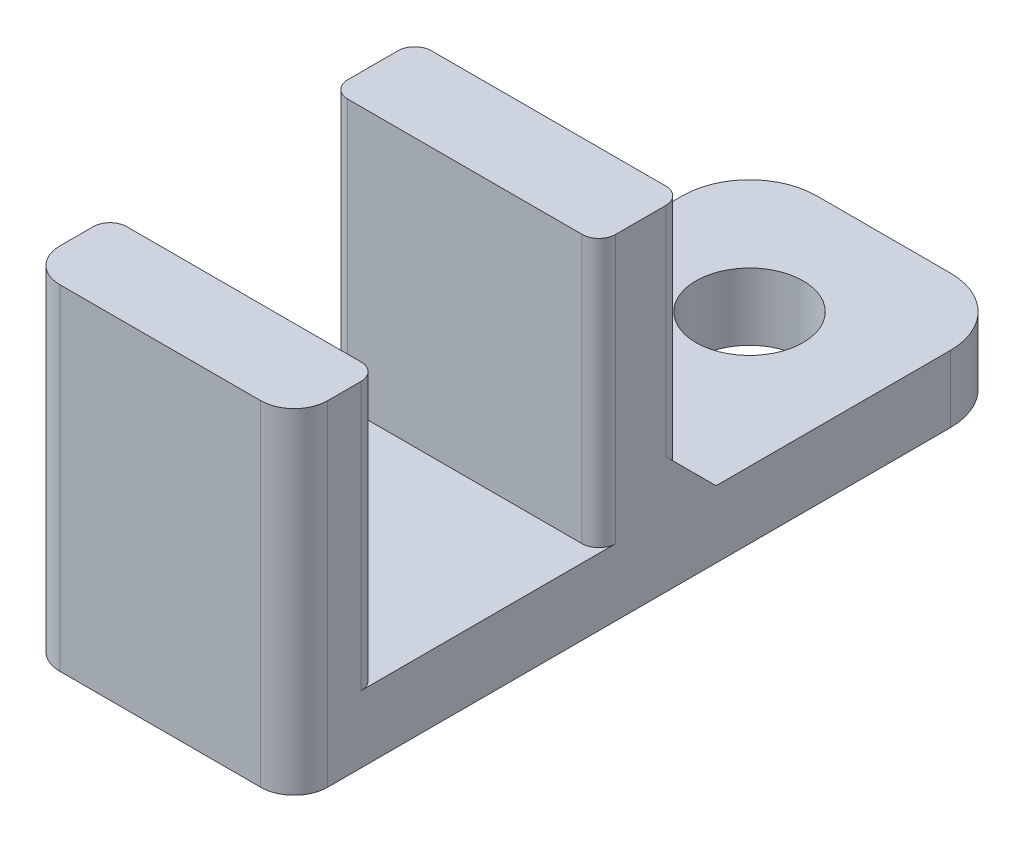
ISO-10303-21;
HEADER;
FILE_DESCRIPTION(('STEP AP214'),'2;1');
FILE_NAME('part.step','',(''),(''),'','','');
FILE_SCHEMA(('AUTOMOTIVE_DESIGN { 1 0 10303 214 1 1 1 1 }'));
ENDSEC;
DATA;
#1=APPLICATION_CONTEXT('core data for automotive mechanical design processes');
#2=APPLICATION_PROTOCOL_DEFINITION('international standard','automotive_design',2000,#1);
#3=PRODUCT_CONTEXT('',#1,'mechanical');
#4=PRODUCT('Part','Part','',(#3));
#5=PRODUCT_RELATED_PRODUCT_CATEGORY('part','',(#4));
#6=PRODUCT_DEFINITION_FORMATION('','',#4);
#7=PRODUCT_DEFINITION_CONTEXT('part definition',#1,'design');
#8=PRODUCT_DEFINITION('design','',#6,#7);
#9=PRODUCT_DEFINITION_SHAPE('','',#8);
#10=(LENGTH_UNIT() NAMED_UNIT(*) SI_UNIT(.MILLI.,.METRE.));
#11=(NAMED_UNIT(*) PLANE_ANGLE_UNIT() SI_UNIT($,.RADIAN.));
#12=(NAMED_UNIT(*) SI_UNIT($,.STERADIAN.) SOLID_ANGLE_UNIT());
#13=UNCERTAINTY_MEASURE_WITH_UNIT(LENGTH_MEASURE(1.E-05),#10,'distance_accuracy_value','');
#14=(GEOMETRIC_REPRESENTATION_CONTEXT(3) GLOBAL_UNCERTAINTY_ASSIGNED_CONTEXT((#13)) GLOBAL_UNIT_ASSIGNED_CONTEXT((#10,
#11,#12)) REPRESENTATION_CONTEXT('',''));
#15=CARTESIAN_POINT('',(0.,0.,0.));
#16=DIRECTION('',(0.,0.,1.));
#17=DIRECTION('',(1.,0.,0.));
#18=AXIS2_PLACEMENT_3D('',#15,#16,#17);
#19=CARTESIAN_POINT('',(3.5,10.,1.2));
#20=DIRECTION('',(0.,1.,0.));
#21=DIRECTION('',(0.,0.,1.));
#22=AXIS2_PLACEMENT_3D('',#19,#20,#21);
#23=CYLINDRICAL_SURFACE('',#22,0.5);
#24=DIRECTION('',(0.,1.,0.));
#25=VECTOR('',#24,1.);
#26=CARTESIAN_POINT('',(3.5,10.,1.7));
#27=LINE('',#26,#25);
#28=CARTESIAN_POINT('',(3.5,2.,1.7));
#29=VERTEX_POINT('',#28);
#30=CARTESIAN_POINT('',(3.5,10.,1.7));
#31=VERTEX_POINT('',#30);
#32=EDGE_CURVE('E306',#29,#31,#27,.T.);
#33=ORIENTED_EDGE('',*,*,#32,.F.);
#34=CARTESIAN_POINT('',(3.5,2.,1.2));
#35=DIRECTION('',(0.,-1.,0.));
#36=DIRECTION('',(0.,0.,-1.));
#37=AXIS2_PLACEMENT_3D('',#34,#35,#36);
#38=CIRCLE('',#37,0.5);
#39=CARTESIAN_POINT('',(4.,2.,1.2));
#40=VERTEX_POINT('',#39);
#41=EDGE_CURVE('E11',#29,#40,#38,.F.);
#42=ORIENTED_EDGE('',*,*,#41,.T.);
#43=DIRECTION('',(0.,1.,0.));
#44=VECTOR('',#43,1.);
#45=CARTESIAN_POINT('',(4.,2.,1.2));
#46=LINE('',#45,#44);
#47=CARTESIAN_POINT('',(4.,10.,1.2));
#48=VERTEX_POINT('',#47);
#49=EDGE_CURVE('E309',#48,#40,#46,.F.);
#50=ORIENTED_EDGE('',*,*,#49,.F.);
#51=CARTESIAN_POINT('',(3.5,10.,1.2));
#52=DIRECTION('',(0.,-1.,0.));
#53=DIRECTION('',(0.,0.,-1.));
#54=AXIS2_PLACEMENT_3D('',#51,#52,#53);
#55=CIRCLE('',#54,0.5);
#56=EDGE_CURVE('E40',#31,#48,#55,.F.);
#57=ORIENTED_EDGE('',*,*,#56,.F.);
#58=EDGE_LOOP('',(#33,#42,#50,#57));
#59=FACE_BOUND('',#58,.T.);
#60=ADVANCED_FACE('F33',(#59),#23,.T.);
#61=CARTESIAN_POINT('',(-3.5,10.,1.2));
#62=DIRECTION('',(0.,-1.,0.));
#63=DIRECTION('',(0.,0.,-1.));
#64=AXIS2_PLACEMENT_3D('',#61,#62,#63);
#65=CYLINDRICAL_SURFACE('',#64,0.5);
#66=DIRECTION('',(0.,-1.,0.));
#67=VECTOR('',#66,1.);
#68=CARTESIAN_POINT('',(-3.5,10.,1.7));
#69=LINE('',#68,#67);
#70=CARTESIAN_POINT('',(-3.5,10.,1.7));
#71=VERTEX_POINT('',#70);
#72=CARTESIAN_POINT('',(-3.5,2.,1.7));
#73=VERTEX_POINT('',#72);
#74=EDGE_CURVE('E296',#71,#73,#69,.T.);
#75=ORIENTED_EDGE('',*,*,#74,.F.);
#76=CARTESIAN_POINT('',(-3.5,10.,1.2));
#77=DIRECTION('',(0.,-1.,0.));
#78=DIRECTION('',(0.,0.,-1.));
#79=AXIS2_PLACEMENT_3D('',#76,#77,#78);
#80=CIRCLE('',#79,0.5);
#81=CARTESIAN_POINT('',(-4.,10.,1.2));
#82=VERTEX_POINT('',#81);
#83=EDGE_CURVE('E302',#82,#71,#80,.F.);
#84=ORIENTED_EDGE('',*,*,#83,.F.);
#85=DIRECTION('',(0.,-1.,0.));
#86=VECTOR('',#85,1.);
#87=CARTESIAN_POINT('',(-4.,2.,1.2));
#88=LINE('',#87,#86);
#89=CARTESIAN_POINT('',(-4.,2.,1.2));
#90=VERTEX_POINT('',#89);
#91=EDGE_CURVE('E299',#90,#82,#88,.F.);
#92=ORIENTED_EDGE('',*,*,#91,.F.);
#93=CARTESIAN_POINT('',(-3.5,2.,1.2));
#94=DIRECTION('',(0.,-1.,0.));
#95=DIRECTION('',(0.,0.,-1.));
#96=AXIS2_PLACEMENT_3D('',#93,#94,#95);
#97=CIRCLE('',#96,0.5);
#98=EDGE_CURVE('E304',#90,#73,#97,.F.);
#99=ORIENTED_EDGE('',*,*,#98,.T.);
#100=EDGE_LOOP('',(#75,#84,#92,#99));
#101=FACE_BOUND('',#100,.T.);
#102=ADVANCED_FACE('F395',(#101),#65,.T.);
#103=CARTESIAN_POINT('',(-3.5,2.,8.8));
#104=DIRECTION('',(0.,-1.,0.));
#105=DIRECTION('',(0.,0.,-1.));
#106=AXIS2_PLACEMENT_3D('',#103,#104,#105);
#107=CYLINDRICAL_SURFACE('',#106,0.5);
#108=DIRECTION('',(0.,-1.,0.));
#109=VECTOR('',#108,1.);
#110=CARTESIAN_POINT('',(-4.,2.,8.8));
#111=LINE('',#110,#109);
#112=CARTESIAN_POINT('',(-4.,10.,8.8));
#113=VERTEX_POINT('',#112);
#114=CARTESIAN_POINT('',(-4.,2.,8.8));
#115=VERTEX_POINT('',#114);
#116=EDGE_CURVE('E285',#113,#115,#111,.T.);
#117=ORIENTED_EDGE('',*,*,#116,.F.);
#118=CARTESIAN_POINT('',(-3.5,10.,8.8));
#119=DIRECTION('',(0.,-1.,0.));
#120=DIRECTION('',(0.,0.,-1.));
#121=AXIS2_PLACEMENT_3D('',#118,#119,#120);
#122=CIRCLE('',#121,0.5);
#123=CARTESIAN_POINT('',(-3.5,10.,8.3));
#124=VERTEX_POINT('',#123);
#125=EDGE_CURVE('E291',#124,#113,#122,.F.);
#126=ORIENTED_EDGE('',*,*,#125,.F.);
#127=DIRECTION('',(0.,-1.,0.));
#128=VECTOR('',#127,1.);
#129=CARTESIAN_POINT('',(-3.5,10.,8.3));
#130=LINE('',#129,#128);
#131=CARTESIAN_POINT('',(-3.5,2.,8.3));
#132=VERTEX_POINT('',#131);
#133=EDGE_CURVE('E288',#132,#124,#130,.F.);
#134=ORIENTED_EDGE('',*,*,#133,.F.);
#135=CARTESIAN_POINT('',(-3.5,2.,8.8));
#136=DIRECTION('',(0.,-1.,0.));
#137=DIRECTION('',(0.,0.,-1.));
#138=AXIS2_PLACEMENT_3D('',#135,#136,#137);
#139=CIRCLE('',#138,0.5);
#140=EDGE_CURVE('E293',#132,#115,#139,.F.);
#141=ORIENTED_EDGE('',*,*,#140,.T.);
#142=EDGE_LOOP('',(#117,#126,#134,#141));
#143=FACE_BOUND('',#142,.T.);
#144=ADVANCED_FACE('F400',(#143),#107,.T.);
#145=CARTESIAN_POINT('',(3.5,2.,8.8));
#146=DIRECTION('',(0.,1.,0.));
#147=DIRECTION('',(0.,0.,1.));
#148=AXIS2_PLACEMENT_3D('',#145,#146,#147);
#149=CYLINDRICAL_SURFACE('',#148,0.5);
#150=DIRECTION('',(0.,1.,0.));
#151=VECTOR('',#150,1.);
#152=CARTESIAN_POINT('',(4.,2.,8.8));
#153=LINE('',#152,#151);
#154=CARTESIAN_POINT('',(4.,2.,8.8));
#155=VERTEX_POINT('',#154);
#156=CARTESIAN_POINT('',(4.,10.,8.8));
#157=VERTEX_POINT('',#156);
#158=EDGE_CURVE('E275',#155,#157,#153,.T.);
#159=ORIENTED_EDGE('',*,*,#158,.F.);
#160=CARTESIAN_POINT('',(3.5,2.,8.8));
#161=DIRECTION('',(0.,-1.,0.));
#162=DIRECTION('',(0.,0.,-1.));
#163=AXIS2_PLACEMENT_3D('',#160,#161,#162);
#164=CIRCLE('',#163,0.5);
#165=CARTESIAN_POINT('',(3.5,2.,8.3));
#166=VERTEX_POINT('',#165);
#167=EDGE_CURVE('E283',#155,#166,#164,.F.);
#168=ORIENTED_EDGE('',*,*,#167,.T.);
#169=DIRECTION('',(0.,1.,0.));
#170=VECTOR('',#169,1.);
#171=CARTESIAN_POINT('',(3.5,10.,8.3));
#172=LINE('',#171,#170);
#173=CARTESIAN_POINT('',(3.5,10.,8.3));
#174=VERTEX_POINT('',#173);
#175=EDGE_CURVE('E278',#174,#166,#172,.F.);
#176=ORIENTED_EDGE('',*,*,#175,.F.);
#177=CARTESIAN_POINT('',(3.5,10.,8.8));
#178=DIRECTION('',(0.,-1.,0.));
#179=DIRECTION('',(0.,0.,-1.));
#180=AXIS2_PLACEMENT_3D('',#177,#178,#179);
#181=CIRCLE('',#180,0.5);
#182=EDGE_CURVE('E281',#157,#174,#181,.F.);
#183=ORIENTED_EDGE('',*,*,#182,.F.);
#184=EDGE_LOOP('',(#159,#168,#176,#183));
#185=FACE_BOUND('',#184,.T.);
#186=ADVANCED_FACE('F405',(#185),#149,.T.);
#187=CARTESIAN_POINT('',(-3.5,2.,-0.3));
#188=DIRECTION('',(0.,-1.,0.));
#189=DIRECTION('',(0.,0.,-1.));
#190=AXIS2_PLACEMENT_3D('',#187,#188,#189);
#191=CYLINDRICAL_SURFACE('',#190,0.5);
#192=DIRECTION('',(0.,-1.,0.));
#193=VECTOR('',#192,1.);
#194=CARTESIAN_POINT('',(-4.,2.,-0.3));
#195=LINE('',#194,#193);
#196=CARTESIAN_POINT('',(-4.,10.,-0.3));
#197=VERTEX_POINT('',#196);
#198=CARTESIAN_POINT('',(-4.,3.50000000000001,-0.3));
#199=VERTEX_POINT('',#198);
#200=EDGE_CURVE('E264',#197,#199,#195,.T.);
#201=ORIENTED_EDGE('',*,*,#200,.F.);
#202=CARTESIAN_POINT('',(-3.5,10.,-0.3));
#203=DIRECTION('',(0.,-1.,0.));
#204=DIRECTION('',(0.,0.,-1.));
#205=AXIS2_PLACEMENT_3D('',#202,#203,#204);
#206=CIRCLE('',#205,0.5);
#207=CARTESIAN_POINT('',(-3.5,10.,-0.8));
#208=VERTEX_POINT('',#207);
#209=EDGE_CURVE('E270',#208,#197,#206,.F.);
#210=ORIENTED_EDGE('',*,*,#209,.F.);
#211=DIRECTION('',(0.,-1.,0.));
#212=VECTOR('',#211,1.);
#213=CARTESIAN_POINT('',(-3.5,10.,-0.8));
#214=LINE('',#213,#212);
#215=CARTESIAN_POINT('',(-3.5,3.,-0.8));
#216=VERTEX_POINT('',#215);
#217=EDGE_CURVE('E267',#216,#208,#214,.F.);
#218=ORIENTED_EDGE('',*,*,#217,.F.);
#219=CARTESIAN_POINT('',(-3.5,3.50000000000001,-0.3));
#220=DIRECTION('',(0.,0.707106781186544,-0.707106781186551));
#221=DIRECTION('',(0.,-0.707106781186551,-0.707106781186544));
#222=AXIS2_PLACEMENT_3D('',#219,#220,#221);
#223=ELLIPSE('',#222,0.707106781186551,0.5);
#224=EDGE_CURVE('E272',#216,#199,#223,.T.);
#225=ORIENTED_EDGE('',*,*,#224,.T.);
#226=EDGE_LOOP('',(#201,#210,#218,#225));
#227=FACE_BOUND('',#226,.T.);
#228=ADVANCED_FACE('F412',(#227),#191,.T.);
#229=CARTESIAN_POINT('',(3.5,10.,-0.3));
#230=DIRECTION('',(0.,-1.,0.));
#231=DIRECTION('',(0.,0.,-1.));
#232=AXIS2_PLACEMENT_3D('',#229,#230,#231);
#233=CYLINDRICAL_SURFACE('',#232,0.5);
#234=DIRECTION('',(0.,-1.,0.));
#235=VECTOR('',#234,1.);
#236=CARTESIAN_POINT('',(3.5,10.,-0.8));
#237=LINE('',#236,#235);
#238=CARTESIAN_POINT('',(3.5,10.,-0.8));
#239=VERTEX_POINT('',#238);
#240=CARTESIAN_POINT('',(3.5,3.,-0.8));
#241=VERTEX_POINT('',#240);
#242=EDGE_CURVE('E254',#239,#241,#237,.T.);
#243=ORIENTED_EDGE('',*,*,#242,.F.);
#244=CARTESIAN_POINT('',(3.5,10.,-0.3));
#245=DIRECTION('',(0.,-1.,0.));
#246=DIRECTION('',(0.,0.,-1.));
#247=AXIS2_PLACEMENT_3D('',#244,#245,#246);
#248=CIRCLE('',#247,0.5);
#249=CARTESIAN_POINT('',(4.,10.,-0.3));
#250=VERTEX_POINT('',#249);
#251=EDGE_CURVE('E260',#250,#239,#248,.F.);
#252=ORIENTED_EDGE('',*,*,#251,.F.);
#253=DIRECTION('',(0.,-1.,0.));
#254=VECTOR('',#253,1.);
#255=CARTESIAN_POINT('',(4.,2.,-0.3));
#256=LINE('',#255,#254);
#257=CARTESIAN_POINT('',(4.,3.50000000000001,-0.3));
#258=VERTEX_POINT('',#257);
#259=EDGE_CURVE('E257',#258,#250,#256,.F.);
#260=ORIENTED_EDGE('',*,*,#259,.F.);
#261=CARTESIAN_POINT('',(3.5,3.50000000000001,-0.3));
#262=DIRECTION('',(0.,0.707106781186544,-0.707106781186551));
#263=DIRECTION('',(0.,-0.707106781186551,-0.707106781186544));
#264=AXIS2_PLACEMENT_3D('',#261,#262,#263);
#265=ELLIPSE('',#264,0.707106781186551,0.5);
#266=EDGE_CURVE('E262',#258,#241,#265,.T.);
#267=ORIENTED_EDGE('',*,*,#266,.T.);
#268=EDGE_LOOP('',(#243,#252,#260,#267));
#269=FACE_BOUND('',#268,.T.);
#270=ADVANCED_FACE('F371',(#269),#233,.T.);
#271=CARTESIAN_POINT('',(-3.,2.,9.8));
#272=DIRECTION('',(0.,1.,0.));
#273=DIRECTION('',(0.,0.,1.));
#274=AXIS2_PLACEMENT_3D('',#271,#272,#273);
#275=CYLINDRICAL_SURFACE('',#274,1.);
#276=DIRECTION('',(0.,1.,0.));
#277=VECTOR('',#276,1.);
#278=CARTESIAN_POINT('',(-4.,2.,9.8));
#279=LINE('',#278,#277);
#280=CARTESIAN_POINT('',(-4.,0.,9.8));
#281=VERTEX_POINT('',#280);
#282=CARTESIAN_POINT('',(-4.,10.,9.8));
#283=VERTEX_POINT('',#282);
#284=EDGE_CURVE('E237',#281,#283,#279,.T.);
#285=ORIENTED_EDGE('',*,*,#284,.F.);
#286=CARTESIAN_POINT('',(-3.,0.,9.8));
#287=DIRECTION('',(0.,-1.,0.));
#288=DIRECTION('',(0.,0.,-1.));
#289=AXIS2_PLACEMENT_3D('',#286,#287,#288);
#290=CIRCLE('',#289,1.);
#291=CARTESIAN_POINT('',(-3.,0.,10.8));
#292=VERTEX_POINT('',#291);
#293=EDGE_CURVE('E198',#292,#281,#290,.T.);
#294=ORIENTED_EDGE('',*,*,#293,.F.);
#295=DIRECTION('',(0.,1.,0.));
#296=VECTOR('',#295,1.);
#297=CARTESIAN_POINT('',(-3.,2.,10.8));
#298=LINE('',#297,#296);
#299=CARTESIAN_POINT('',(-3.,10.,10.8));
#300=VERTEX_POINT('',#299);
#301=EDGE_CURVE('E239',#300,#292,#298,.F.);
#302=ORIENTED_EDGE('',*,*,#301,.F.);
#303=CARTESIAN_POINT('',(-3.,10.,9.8));
#304=DIRECTION('',(0.,-1.,0.));
#305=DIRECTION('',(0.,0.,-1.));
#306=AXIS2_PLACEMENT_3D('',#303,#304,#305);
#307=CIRCLE('',#306,1.);
#308=EDGE_CURVE('E243',#283,#300,#307,.F.);
#309=ORIENTED_EDGE('',*,*,#308,.F.);
#310=EDGE_LOOP('',(#285,#294,#302,#309));
#311=FACE_BOUND('',#310,.T.);
#312=ADVANCED_FACE('F419',(#311),#275,.T.);
#313=CARTESIAN_POINT('',(3.,2.,9.8));
#314=DIRECTION('',(0.,-1.,0.));
#315=DIRECTION('',(0.,0.,-1.));
#316=AXIS2_PLACEMENT_3D('',#313,#314,#315);
#317=CYLINDRICAL_SURFACE('',#316,1.);
#318=DIRECTION('',(0.,-1.,0.));
#319=VECTOR('',#318,1.);
#320=CARTESIAN_POINT('',(4.,2.,9.8));
#321=LINE('',#320,#319);
#322=CARTESIAN_POINT('',(4.,10.,9.8));
#323=VERTEX_POINT('',#322);
#324=CARTESIAN_POINT('',(4.,0.,9.8));
#325=VERTEX_POINT('',#324);
#326=EDGE_CURVE('E226',#323,#325,#321,.T.);
#327=ORIENTED_EDGE('',*,*,#326,.F.);
#328=CARTESIAN_POINT('',(3.,10.,9.8));
#329=DIRECTION('',(0.,-1.,0.));
#330=DIRECTION('',(0.,0.,-1.));
#331=AXIS2_PLACEMENT_3D('',#328,#329,#330);
#332=CIRCLE('',#331,1.);
#333=CARTESIAN_POINT('',(3.,10.,10.8));
#334=VERTEX_POINT('',#333);
#335=EDGE_CURVE('E232',#334,#323,#332,.F.);
#336=ORIENTED_EDGE('',*,*,#335,.F.);
#337=DIRECTION('',(0.,-1.,0.));
#338=VECTOR('',#337,1.);
#339=CARTESIAN_POINT('',(3.,2.,10.8));
#340=LINE('',#339,#338);
#341=CARTESIAN_POINT('',(3.,0.,10.8));
#342=VERTEX_POINT('',#341);
#343=EDGE_CURVE('E229',#342,#334,#340,.F.);
#344=ORIENTED_EDGE('',*,*,#343,.F.);
#345=CARTESIAN_POINT('',(3.,0.,9.8));
#346=DIRECTION('',(0.,-1.,0.));
#347=DIRECTION('',(0.,0.,-1.));
#348=AXIS2_PLACEMENT_3D('',#345,#346,#347);
#349=CIRCLE('',#348,1.);
#350=EDGE_CURVE('E234',#325,#342,#349,.T.);
#351=ORIENTED_EDGE('',*,*,#350,.F.);
#352=EDGE_LOOP('',(#327,#336,#344,#351));
#353=FACE_BOUND('',#352,.T.);
#354=ADVANCED_FACE('F423',(#353),#317,.T.);
#355=CARTESIAN_POINT('',(2.,2.,-8.8));
#356=DIRECTION('',(0.,-1.,0.));
#357=DIRECTION('',(0.,0.,-1.));
#358=AXIS2_PLACEMENT_3D('',#355,#356,#357);
#359=CYLINDRICAL_SURFACE('',#358,2.);
#360=DIRECTION('',(0.,-1.,0.));
#361=VECTOR('',#360,1.);
#362=CARTESIAN_POINT('',(2.,2.,-10.8));
#363=LINE('',#362,#361);
#364=CARTESIAN_POINT('',(2.,2.,-10.8));
#365=VERTEX_POINT('',#364);
#366=CARTESIAN_POINT('',(2.,0.,-10.8));
#367=VERTEX_POINT('',#366);
#368=EDGE_CURVE('E185',#365,#367,#363,.T.);
#369=ORIENTED_EDGE('',*,*,#368,.F.);
#370=CARTESIAN_POINT('',(2.,2.,-8.8));
#371=DIRECTION('',(0.,-1.,0.));
#372=DIRECTION('',(0.,0.,-1.));
#373=AXIS2_PLACEMENT_3D('',#370,#371,#372);
#374=CIRCLE('',#373,2.);
#375=CARTESIAN_POINT('',(4.,2.,-8.8));
#376=VERTEX_POINT('',#375);
#377=EDGE_CURVE('E221',#376,#365,#374,.F.);
#378=ORIENTED_EDGE('',*,*,#377,.F.);
#379=DIRECTION('',(0.,-1.,0.));
#380=VECTOR('',#379,1.);
#381=CARTESIAN_POINT('',(4.,2.,-8.8));
#382=LINE('',#381,#380);
#383=CARTESIAN_POINT('',(4.,0.,-8.8));
#384=VERTEX_POINT('',#383);
#385=EDGE_CURVE('E218',#384,#376,#382,.F.);
#386=ORIENTED_EDGE('',*,*,#385,.F.);
#387=CARTESIAN_POINT('',(2.,0.,-8.8));
#388=DIRECTION('',(0.,-1.,0.));
#389=DIRECTION('',(0.,0.,-1.));
#390=AXIS2_PLACEMENT_3D('',#387,#388,#389);
#391=CIRCLE('',#390,2.);
#392=EDGE_CURVE('E223',#367,#384,#391,.T.);
#393=ORIENTED_EDGE('',*,*,#392,.F.);
#394=EDGE_LOOP('',(#369,#378,#386,#393));
#395=FACE_BOUND('',#394,.T.);
#396=ADVANCED_FACE('F357',(#395),#359,.T.);
#397=CARTESIAN_POINT('',(-2.,2.,-8.8));
#398=DIRECTION('',(0.,-1.,0.));
#399=DIRECTION('',(0.,0.,-1.));
#400=AXIS2_PLACEMENT_3D('',#397,#398,#399);
#401=CYLINDRICAL_SURFACE('',#400,2.);
#402=DIRECTION('',(0.,-1.,0.));
#403=VECTOR('',#402,1.);
#404=CARTESIAN_POINT('',(-4.,2.,-8.8));
#405=LINE('',#404,#403);
#406=CARTESIAN_POINT('',(-4.,2.,-8.8));
#407=VERTEX_POINT('',#406);
#408=CARTESIAN_POINT('',(-4.,0.,-8.8));
#409=VERTEX_POINT('',#408);
#410=EDGE_CURVE('E178',#407,#409,#405,.T.);
#411=ORIENTED_EDGE('',*,*,#410,.F.);
#412=CARTESIAN_POINT('',(-2.,2.,-8.8));
#413=DIRECTION('',(0.,-1.,0.));
#414=DIRECTION('',(0.,0.,-1.));
#415=AXIS2_PLACEMENT_3D('',#412,#413,#414);
#416=CIRCLE('',#415,2.);
#417=CARTESIAN_POINT('',(-2.,2.,-10.8));
#418=VERTEX_POINT('',#417);
#419=EDGE_CURVE('E186',#418,#407,#416,.F.);
#420=ORIENTED_EDGE('',*,*,#419,.F.);
#421=DIRECTION('',(0.,-1.,0.));
#422=VECTOR('',#421,1.);
#423=CARTESIAN_POINT('',(-2.,2.,-10.8));
#424=LINE('',#423,#422);
#425=CARTESIAN_POINT('',(-2.,0.,-10.8));
#426=VERTEX_POINT('',#425);
#427=EDGE_CURVE('E181',#426,#418,#424,.F.);
#428=ORIENTED_EDGE('',*,*,#427,.F.);
#429=CARTESIAN_POINT('',(-2.,0.,-8.8));
#430=DIRECTION('',(0.,-1.,0.));
#431=DIRECTION('',(0.,0.,-1.));
#432=AXIS2_PLACEMENT_3D('',#429,#430,#431);
#433=CIRCLE('',#432,2.);
#434=EDGE_CURVE('E174',#409,#426,#433,.T.);
#435=ORIENTED_EDGE('',*,*,#434,.F.);
#436=EDGE_LOOP('',(#411,#420,#428,#435));
#437=FACE_BOUND('',#436,.T.);
#438=ADVANCED_FACE('F176',(#437),#401,.T.);
#439=CARTESIAN_POINT('',(0.,2.,0.));
#440=DIRECTION('',(0.,-1.,0.));
#441=DIRECTION('',(0.,0.,-1.));
#442=AXIS2_PLACEMENT_3D('',#439,#440,#441);
#443=PLANE('',#442);
#444=DIRECTION('',(1.,0.,0.));
#445=VECTOR('',#444,1.);
#446=CARTESIAN_POINT('',(-4.,2.,1.7));
#447=LINE('',#446,#445);
#448=EDGE_CURVE('E211',#73,#29,#447,.T.);
#449=ORIENTED_EDGE('',*,*,#448,.F.);
#450=ORIENTED_EDGE('',*,*,#98,.F.);
#451=DIRECTION('',(0.,0.,1.));
#452=VECTOR('',#451,1.);
#453=CARTESIAN_POINT('',(-4.,2.,10.8));
#454=LINE('',#453,#452);
#455=EDGE_CURVE('E348',#90,#115,#454,.T.);
#456=ORIENTED_EDGE('',*,*,#455,.T.);
#457=ORIENTED_EDGE('',*,*,#140,.F.);
#458=DIRECTION('',(-1.,0.,0.));
#459=VECTOR('',#458,1.);
#460=CARTESIAN_POINT('',(-4.,2.,8.3));
#461=LINE('',#460,#459);
#462=EDGE_CURVE('E335',#166,#132,#461,.T.);
#463=ORIENTED_EDGE('',*,*,#462,.F.);
#464=ORIENTED_EDGE('',*,*,#167,.F.);
#465=DIRECTION('',(0.,0.,-1.));
#466=VECTOR('',#465,1.);
#467=CARTESIAN_POINT('',(4.,2.,10.8));
#468=LINE('',#467,#466);
#469=EDGE_CURVE('E47',#155,#40,#468,.T.);
#470=ORIENTED_EDGE('',*,*,#469,.T.);
#471=ORIENTED_EDGE('',*,*,#41,.F.);
#472=EDGE_LOOP('',(#449,#450,#456,#457,#463,#464,#470,#471));
#473=FACE_BOUND('',#472,.T.);
#474=ADVANCED_FACE('F319',(#473),#443,.F.);
#475=CARTESIAN_POINT('',(0.,2.,-6.8));
#476=DIRECTION('',(0.,1.,0.));
#477=DIRECTION('',(0.,0.,1.));
#478=AXIS2_PLACEMENT_3D('',#475,#476,#477);
#479=CIRCLE('',#478,1.6);
#480=CARTESIAN_POINT('',(0.,2.,-5.2));
#481=VERTEX_POINT('',#480);
#482=EDGE_CURVE('E212',#481,#481,#479,.T.);
#483=ORIENTED_EDGE('',*,*,#482,.F.);
#484=EDGE_LOOP('',(#483));
#485=FACE_BOUND('',#484,.T.);
#486=CARTESIAN_POINT('',(-4.,2.,-1.79999999999999));
#487=VERTEX_POINT('',#486);
#488=EDGE_CURVE('E194',#407,#487,#454,.T.);
#489=ORIENTED_EDGE('',*,*,#488,.T.);
#490=DIRECTION('',(1.,0.,0.));
#491=VECTOR('',#490,1.);
#492=CARTESIAN_POINT('',(4.,2.,-1.79999999999999));
#493=LINE('',#492,#491);
#494=CARTESIAN_POINT('',(4.,2.,-1.79999999999999));
#495=VERTEX_POINT('',#494);
#496=EDGE_CURVE('E248',#487,#495,#493,.T.);
#497=ORIENTED_EDGE('',*,*,#496,.T.);
#498=EDGE_CURVE('E203',#495,#376,#468,.T.);
#499=ORIENTED_EDGE('',*,*,#498,.T.);
#500=ORIENTED_EDGE('',*,*,#377,.T.);
#501=DIRECTION('',(-1.,0.,0.));
#502=VECTOR('',#501,1.);
#503=CARTESIAN_POINT('',(-4.,2.,-10.8));
#504=LINE('',#503,#502);
#505=EDGE_CURVE('E346',#365,#418,#504,.T.);
#506=ORIENTED_EDGE('',*,*,#505,.T.);
#507=ORIENTED_EDGE('',*,*,#419,.T.);
#508=EDGE_LOOP('',(#489,#497,#499,#500,#506,#507));
#509=FACE_BOUND('',#508,.T.);
#510=ADVANCED_FACE('F360',(#485,#509),#443,.F.);
#511=CARTESIAN_POINT('',(4.,2.,10.8));
#512=DIRECTION('',(-1.,0.,0.));
#513=DIRECTION('',(0.,0.,1.));
#514=AXIS2_PLACEMENT_3D('',#511,#512,#513);
#515=PLANE('',#514);
#516=DIRECTION('',(0.,0.,-1.));
#517=VECTOR('',#516,1.);
#518=CARTESIAN_POINT('',(4.,10.,1.7));
#519=LINE('',#518,#517);
#520=EDGE_CURVE('E314',#48,#250,#519,.T.);
#521=ORIENTED_EDGE('',*,*,#520,.F.);
#522=ORIENTED_EDGE('',*,*,#49,.T.);
#523=ORIENTED_EDGE('',*,*,#469,.F.);
#524=ORIENTED_EDGE('',*,*,#158,.T.);
#525=DIRECTION('',(0.,0.,-1.));
#526=VECTOR('',#525,1.);
#527=CARTESIAN_POINT('',(4.,10.,10.8));
#528=LINE('',#527,#526);
#529=EDGE_CURVE('E337',#323,#157,#528,.T.);
#530=ORIENTED_EDGE('',*,*,#529,.F.);
#531=ORIENTED_EDGE('',*,*,#326,.T.);
#532=DIRECTION('',(0.,0.,-1.));
#533=VECTOR('',#532,1.);
#534=CARTESIAN_POINT('',(4.,0.,10.8));
#535=LINE('',#534,#533);
#536=EDGE_CURVE('E205',#325,#384,#535,.T.);
#537=ORIENTED_EDGE('',*,*,#536,.T.);
#538=ORIENTED_EDGE('',*,*,#385,.T.);
#539=ORIENTED_EDGE('',*,*,#498,.F.);
#540=DIRECTION('',(0.,-0.707106781186551,-0.707106781186544));
#541=VECTOR('',#540,1.);
#542=CARTESIAN_POINT('',(4.,8.3,4.49999999999994));
#543=LINE('',#542,#541);
#544=EDGE_CURVE('E252',#495,#258,#543,.F.);
#545=ORIENTED_EDGE('',*,*,#544,.T.);
#546=ORIENTED_EDGE('',*,*,#259,.T.);
#547=EDGE_LOOP('',(#521,#522,#523,#524,#530,#531,#537,#538,#539,#545,#546));
#548=FACE_BOUND('',#547,.T.);
#549=ADVANCED_FACE('F313',(#548),#515,.F.);
#550=CARTESIAN_POINT('',(-4.,2.,-10.8));
#551=DIRECTION('',(0.,0.,1.));
#552=DIRECTION('',(1.,0.,0.));
#553=AXIS2_PLACEMENT_3D('',#550,#551,#552);
#554=PLANE('',#553);
#555=ORIENTED_EDGE('',*,*,#505,.F.);
#556=ORIENTED_EDGE('',*,*,#368,.T.);
#557=DIRECTION('',(-1.,0.,0.));
#558=VECTOR('',#557,1.);
#559=CARTESIAN_POINT('',(-4.,0.,-10.8));
#560=LINE('',#559,#558);
#561=EDGE_CURVE('E201',#367,#426,#560,.T.);
#562=ORIENTED_EDGE('',*,*,#561,.T.);
#563=ORIENTED_EDGE('',*,*,#427,.T.);
#564=EDGE_LOOP('',(#555,#556,#562,#563));
#565=FACE_BOUND('',#564,.T.);
#566=ADVANCED_FACE('F389',(#565),#554,.F.);
#567=CARTESIAN_POINT('',(-4.,2.,10.8));
#568=DIRECTION('',(1.,0.,0.));
#569=DIRECTION('',(0.,0.,-1.));
#570=AXIS2_PLACEMENT_3D('',#567,#568,#569);
#571=PLANE('',#570);
#572=ORIENTED_EDGE('',*,*,#455,.F.);
#573=ORIENTED_EDGE('',*,*,#91,.T.);
#574=DIRECTION('',(0.,0.,1.));
#575=VECTOR('',#574,1.);
#576=CARTESIAN_POINT('',(-4.,10.,1.7));
#577=LINE('',#576,#575);
#578=EDGE_CURVE('E323',#197,#82,#577,.T.);
#579=ORIENTED_EDGE('',*,*,#578,.F.);
#580=ORIENTED_EDGE('',*,*,#200,.T.);
#581=DIRECTION('',(0.,0.707106781186551,0.707106781186544));
#582=VECTOR('',#581,1.);
#583=CARTESIAN_POINT('',(-4.,8.3,4.49999999999994));
#584=LINE('',#583,#582);
#585=EDGE_CURVE('E250',#199,#487,#584,.F.);
#586=ORIENTED_EDGE('',*,*,#585,.T.);
#587=ORIENTED_EDGE('',*,*,#488,.F.);
#588=ORIENTED_EDGE('',*,*,#410,.T.);
#589=DIRECTION('',(0.,0.,1.));
#590=VECTOR('',#589,1.);
#591=CARTESIAN_POINT('',(-4.,0.,10.8));
#592=LINE('',#591,#590);
#593=EDGE_CURVE('E192',#409,#281,#592,.T.);
#594=ORIENTED_EDGE('',*,*,#593,.T.);
#595=ORIENTED_EDGE('',*,*,#284,.T.);
#596=DIRECTION('',(0.,0.,1.));
#597=VECTOR('',#596,1.);
#598=CARTESIAN_POINT('',(-4.,10.,10.8));
#599=LINE('',#598,#597);
#600=EDGE_CURVE('E332',#113,#283,#599,.T.);
#601=ORIENTED_EDGE('',*,*,#600,.F.);
#602=ORIENTED_EDGE('',*,*,#116,.T.);
#603=EDGE_LOOP('',(#572,#573,#579,#580,#586,#587,#588,#594,#595,#601,#602));
#604=FACE_BOUND('',#603,.T.);
#605=ADVANCED_FACE('F190',(#604),#571,.F.);
#606=CARTESIAN_POINT('',(-4.,2.,10.8));
#607=DIRECTION('',(0.,0.,-1.));
#608=DIRECTION('',(-1.,0.,0.));
#609=AXIS2_PLACEMENT_3D('',#606,#607,#608);
#610=PLANE('',#609);
#611=DIRECTION('',(1.,0.,0.));
#612=VECTOR('',#611,1.);
#613=CARTESIAN_POINT('',(-4.,10.,10.8));
#614=LINE('',#613,#612);
#615=EDGE_CURVE('E334',#300,#334,#614,.T.);
#616=ORIENTED_EDGE('',*,*,#615,.F.);
#617=ORIENTED_EDGE('',*,*,#301,.T.);
#618=DIRECTION('',(1.,0.,0.));
#619=VECTOR('',#618,1.);
#620=CARTESIAN_POINT('',(-4.,0.,10.8));
#621=LINE('',#620,#619);
#622=EDGE_CURVE('E200',#292,#342,#621,.T.);
#623=ORIENTED_EDGE('',*,*,#622,.T.);
#624=ORIENTED_EDGE('',*,*,#343,.T.);
#625=EDGE_LOOP('',(#616,#617,#623,#624));
#626=FACE_BOUND('',#625,.T.);
#627=ADVANCED_FACE('F437',(#626),#610,.F.);
#628=CARTESIAN_POINT('',(0.,0.,0.));
#629=DIRECTION('',(0.,-1.,0.));
#630=DIRECTION('',(0.,0.,-1.));
#631=AXIS2_PLACEMENT_3D('',#628,#629,#630);
#632=PLANE('',#631);
#633=CARTESIAN_POINT('',(0.,0.,-6.8));
#634=DIRECTION('',(0.,-1.,0.));
#635=DIRECTION('',(0.,0.,-1.));
#636=AXIS2_PLACEMENT_3D('',#633,#634,#635);
#637=CIRCLE('',#636,1.6);
#638=CARTESIAN_POINT('',(0.,0.,-8.4));
#639=VERTEX_POINT('',#638);
#640=EDGE_CURVE('E209',#639,#639,#637,.T.);
#641=ORIENTED_EDGE('',*,*,#640,.F.);
#642=EDGE_LOOP('',(#641));
#643=FACE_BOUND('',#642,.T.);
#644=ORIENTED_EDGE('',*,*,#622,.F.);
#645=ORIENTED_EDGE('',*,*,#293,.T.);
#646=ORIENTED_EDGE('',*,*,#593,.F.);
#647=ORIENTED_EDGE('',*,*,#434,.T.);
#648=ORIENTED_EDGE('',*,*,#561,.F.);
#649=ORIENTED_EDGE('',*,*,#392,.T.);
#650=ORIENTED_EDGE('',*,*,#536,.F.);
#651=ORIENTED_EDGE('',*,*,#350,.T.);
#652=EDGE_LOOP('',(#644,#645,#646,#647,#648,#649,#650,#651));
#653=FACE_BOUND('',#652,.T.);
#654=ADVANCED_FACE('F197',(#643,#653),#632,.T.);
#655=CARTESIAN_POINT('',(-4.,10.,8.3));
#656=DIRECTION('',(0.,0.,1.));
#657=DIRECTION('',(1.,0.,0.));
#658=AXIS2_PLACEMENT_3D('',#655,#656,#657);
#659=PLANE('',#658);
#660=ORIENTED_EDGE('',*,*,#462,.T.);
#661=ORIENTED_EDGE('',*,*,#133,.T.);
#662=DIRECTION('',(-1.,0.,0.));
#663=VECTOR('',#662,1.);
#664=CARTESIAN_POINT('',(-4.,10.,8.3));
#665=LINE('',#664,#663);
#666=EDGE_CURVE('E340',#174,#124,#665,.T.);
#667=ORIENTED_EDGE('',*,*,#666,.F.);
#668=ORIENTED_EDGE('',*,*,#175,.T.);
#669=EDGE_LOOP('',(#660,#661,#667,#668));
#670=FACE_BOUND('',#669,.T.);
#671=ADVANCED_FACE('F441',(#670),#659,.F.);
#672=CARTESIAN_POINT('',(0.,10.,0.));
#673=DIRECTION('',(0.,-1.,0.));
#674=DIRECTION('',(0.,0.,-1.));
#675=AXIS2_PLACEMENT_3D('',#672,#673,#674);
#676=PLANE('',#675);
#677=ORIENTED_EDGE('',*,*,#666,.T.);
#678=ORIENTED_EDGE('',*,*,#125,.T.);
#679=ORIENTED_EDGE('',*,*,#600,.T.);
#680=ORIENTED_EDGE('',*,*,#308,.T.);
#681=ORIENTED_EDGE('',*,*,#615,.T.);
#682=ORIENTED_EDGE('',*,*,#335,.T.);
#683=ORIENTED_EDGE('',*,*,#529,.T.);
#684=ORIENTED_EDGE('',*,*,#182,.T.);
#685=EDGE_LOOP('',(#677,#678,#679,#680,#681,#682,#683,#684));
#686=FACE_BOUND('',#685,.T.);
#687=ADVANCED_FACE('F447',(#686),#676,.F.);
#688=CARTESIAN_POINT('',(-4.,10.,1.7));
#689=DIRECTION('',(0.,0.,-1.));
#690=DIRECTION('',(-1.,0.,0.));
#691=AXIS2_PLACEMENT_3D('',#688,#689,#690);
#692=PLANE('',#691);
#693=ORIENTED_EDGE('',*,*,#448,.T.);
#694=ORIENTED_EDGE('',*,*,#32,.T.);
#695=DIRECTION('',(1.,0.,0.));
#696=VECTOR('',#695,1.);
#697=CARTESIAN_POINT('',(-4.,10.,1.7));
#698=LINE('',#697,#696);
#699=EDGE_CURVE('E326',#71,#31,#698,.T.);
#700=ORIENTED_EDGE('',*,*,#699,.F.);
#701=ORIENTED_EDGE('',*,*,#74,.T.);
#702=EDGE_LOOP('',(#693,#694,#700,#701));
#703=FACE_BOUND('',#702,.T.);
#704=ADVANCED_FACE('F462',(#703),#692,.F.);
#705=CARTESIAN_POINT('',(-4.,10.,-0.8));
#706=DIRECTION('',(0.,0.,1.));
#707=DIRECTION('',(1.,0.,0.));
#708=AXIS2_PLACEMENT_3D('',#705,#706,#707);
#709=PLANE('',#708);
#710=DIRECTION('',(-1.,0.,0.));
#711=VECTOR('',#710,1.);
#712=CARTESIAN_POINT('',(-4.,3.,-0.8));
#713=LINE('',#712,#711);
#714=EDGE_CURVE('E245',#241,#216,#713,.T.);
#715=ORIENTED_EDGE('',*,*,#714,.T.);
#716=ORIENTED_EDGE('',*,*,#217,.T.);
#717=DIRECTION('',(-1.,0.,0.));
#718=VECTOR('',#717,1.);
#719=CARTESIAN_POINT('',(-4.,10.,-0.8));
#720=LINE('',#719,#718);
#721=EDGE_CURVE('E330',#239,#208,#720,.T.);
#722=ORIENTED_EDGE('',*,*,#721,.F.);
#723=ORIENTED_EDGE('',*,*,#242,.T.);
#724=EDGE_LOOP('',(#715,#716,#722,#723));
#725=FACE_BOUND('',#724,.T.);
#726=ADVANCED_FACE('F457',(#725),#709,.F.);
#727=CARTESIAN_POINT('',(0.,10.,0.));
#728=DIRECTION('',(0.,-1.,0.));
#729=DIRECTION('',(0.,0.,-1.));
#730=AXIS2_PLACEMENT_3D('',#727,#728,#729);
#731=PLANE('',#730);
#732=ORIENTED_EDGE('',*,*,#699,.T.);
#733=ORIENTED_EDGE('',*,*,#56,.T.);
#734=ORIENTED_EDGE('',*,*,#520,.T.);
#735=ORIENTED_EDGE('',*,*,#251,.T.);
#736=ORIENTED_EDGE('',*,*,#721,.T.);
#737=ORIENTED_EDGE('',*,*,#209,.T.);
#738=ORIENTED_EDGE('',*,*,#578,.T.);
#739=ORIENTED_EDGE('',*,*,#83,.T.);
#740=EDGE_LOOP('',(#732,#733,#734,#735,#736,#737,#738,#739));
#741=FACE_BOUND('',#740,.T.);
#742=ADVANCED_FACE('F374',(#741),#731,.F.);
#743=CARTESIAN_POINT('',(0.,-6.,-6.8));
#744=DIRECTION('',(0.,1.,0.));
#745=DIRECTION('',(0.,0.,1.));
#746=AXIS2_PLACEMENT_3D('',#743,#744,#745);
#747=CYLINDRICAL_SURFACE('',#746,1.6);
#748=ORIENTED_EDGE('',*,*,#640,.T.);
#749=EDGE_LOOP('',(#748));
#750=FACE_BOUND('',#749,.T.);
#751=ORIENTED_EDGE('',*,*,#482,.T.);
#752=EDGE_LOOP('',(#751));
#753=FACE_BOUND('',#752,.T.);
#754=ADVANCED_FACE('F380',(#750,#753),#747,.F.);
#755=CARTESIAN_POINT('',(-4.,3.,-0.8));
#756=DIRECTION('',(0.,0.707106781186544,-0.707106781186551));
#757=DIRECTION('',(1.,0.,0.));
#758=AXIS2_PLACEMENT_3D('',#755,#756,#757);
#759=PLANE('',#758);
#760=ORIENTED_EDGE('',*,*,#544,.F.);
#761=ORIENTED_EDGE('',*,*,#496,.F.);
#762=ORIENTED_EDGE('',*,*,#585,.F.);
#763=ORIENTED_EDGE('',*,*,#224,.F.);
#764=ORIENTED_EDGE('',*,*,#714,.F.);
#765=ORIENTED_EDGE('',*,*,#266,.F.);
#766=EDGE_LOOP('',(#760,#761,#762,#763,#764,#765));
#767=FACE_BOUND('',#766,.T.);
#768=ADVANCED_FACE('F365',(#767),#759,.T.);
#769=CLOSED_SHELL('',(#60,#102,#144,#186,#228,#270,#312,#354,#396,#438,#474,#510,#549,#566,#605,
#627,#654,#671,#687,#704,#726,#742,#754,#768));
#770=MANIFOLD_SOLID_BREP('B2',#769);
#771=ADVANCED_BREP_SHAPE_REPRESENTATION('',(#18,#770),#14);
#772=SHAPE_DEFINITION_REPRESENTATION(#9,#771);
ENDSEC;
END-ISO-10303-21;
